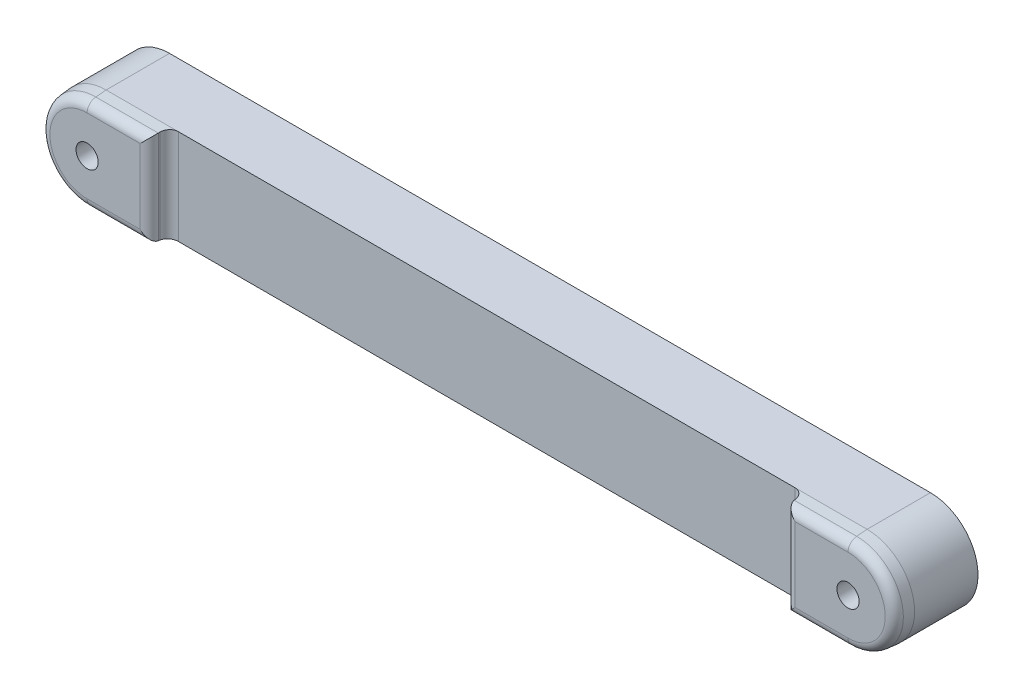
ISO-10303-21;
HEADER;
FILE_DESCRIPTION(('STEP AP214'),'2;1');
FILE_NAME('part.step','',(''),(''),'','','');
FILE_SCHEMA(('AUTOMOTIVE_DESIGN { 1 0 10303 214 1 1 1 1 }'));
ENDSEC;
DATA;
#1=APPLICATION_CONTEXT('core data for automotive mechanical design processes');
#2=APPLICATION_PROTOCOL_DEFINITION('international standard','automotive_design',2000,#1);
#3=PRODUCT_CONTEXT('',#1,'mechanical');
#4=PRODUCT('Part','Part','',(#3));
#5=PRODUCT_RELATED_PRODUCT_CATEGORY('part','',(#4));
#6=PRODUCT_DEFINITION_FORMATION('','',#4);
#7=PRODUCT_DEFINITION_CONTEXT('part definition',#1,'design');
#8=PRODUCT_DEFINITION('design','',#6,#7);
#9=PRODUCT_DEFINITION_SHAPE('','',#8);
#10=(LENGTH_UNIT() NAMED_UNIT(*) SI_UNIT(.MILLI.,.METRE.));
#11=(NAMED_UNIT(*) PLANE_ANGLE_UNIT() SI_UNIT($,.RADIAN.));
#12=(NAMED_UNIT(*) SI_UNIT($,.STERADIAN.) SOLID_ANGLE_UNIT());
#13=UNCERTAINTY_MEASURE_WITH_UNIT(LENGTH_MEASURE(1.E-05),#10,'distance_accuracy_value','');
#14=(GEOMETRIC_REPRESENTATION_CONTEXT(3) GLOBAL_UNCERTAINTY_ASSIGNED_CONTEXT((#13)) GLOBAL_UNIT_ASSIGNED_CONTEXT((#10,
#11,#12)) REPRESENTATION_CONTEXT('',''));
#15=CARTESIAN_POINT('',(0.,0.,0.));
#16=DIRECTION('',(0.,0.,1.));
#17=DIRECTION('',(1.,0.,0.));
#18=AXIS2_PLACEMENT_3D('',#15,#16,#17);
#19=CARTESIAN_POINT('',(60.,0.,0.));
#20=DIRECTION('',(0.,0.,1.));
#21=DIRECTION('',(1.,0.,0.));
#22=AXIS2_PLACEMENT_3D('',#19,#20,#21);
#23=CYLINDRICAL_SURFACE('',#22,1.75);
#24=CARTESIAN_POINT('',(60.,0.,13.));
#25=DIRECTION('',(0.,0.,-1.));
#26=DIRECTION('',(-1.,0.,0.));
#27=AXIS2_PLACEMENT_3D('',#24,#25,#26);
#28=CIRCLE('',#27,1.75);
#29=CARTESIAN_POINT('',(58.25,0.,13.));
#30=VERTEX_POINT('',#29);
#31=EDGE_CURVE('E292',#30,#30,#28,.T.);
#32=ORIENTED_EDGE('',*,*,#31,.F.);
#33=EDGE_LOOP('',(#32));
#34=FACE_BOUND('',#33,.T.);
#35=CARTESIAN_POINT('',(60.,0.,10.));
#36=DIRECTION('',(0.,0.,-1.));
#37=DIRECTION('',(-1.,0.,0.));
#38=AXIS2_PLACEMENT_3D('',#35,#36,#37);
#39=CIRCLE('',#38,1.75);
#40=CARTESIAN_POINT('',(58.25,0.,10.));
#41=VERTEX_POINT('',#40);
#42=EDGE_CURVE('E300',#41,#41,#39,.T.);
#43=ORIENTED_EDGE('',*,*,#42,.T.);
#44=EDGE_LOOP('',(#43));
#45=FACE_BOUND('',#44,.T.);
#46=ADVANCED_FACE('F41',(#34,#45),#23,.F.);
#47=CARTESIAN_POINT('',(-60.,0.,10.));
#48=DIRECTION('',(0.,0.,1.));
#49=DIRECTION('',(1.,0.,0.));
#50=AXIS2_PLACEMENT_3D('',#47,#48,#49);
#51=PLANE('',#50);
#52=DIRECTION('',(1.,0.,0.));
#53=VECTOR('',#52,1.);
#54=CARTESIAN_POINT('',(-60.,-7.5,10.));
#55=LINE('',#54,#53);
#56=CARTESIAN_POINT('',(-48.6255032389738,-7.5,10.));
#57=VERTEX_POINT('',#56);
#58=CARTESIAN_POINT('',(48.6255032389739,-7.49999999999998,10.));
#59=VERTEX_POINT('',#58);
#60=EDGE_CURVE('E197',#57,#59,#55,.T.);
#61=ORIENTED_EDGE('',*,*,#60,.T.);
#62=DIRECTION('',(0.,1.,0.));
#63=VECTOR('',#62,1.);
#64=CARTESIAN_POINT('',(48.6255032389738,-1.00498778964503E-13,10.));
#65=LINE('',#64,#63);
#66=CARTESIAN_POINT('',(48.6255032389739,7.50000000000002,10.));
#67=VERTEX_POINT('',#66);
#68=EDGE_CURVE('E280',#59,#67,#65,.T.);
#69=ORIENTED_EDGE('',*,*,#68,.T.);
#70=DIRECTION('',(-1.,0.,0.));
#71=VECTOR('',#70,1.);
#72=CARTESIAN_POINT('',(-60.,7.5,10.));
#73=LINE('',#72,#71);
#74=CARTESIAN_POINT('',(-48.6255032389739,7.5,10.));
#75=VERTEX_POINT('',#74);
#76=EDGE_CURVE('E208',#67,#75,#73,.T.);
#77=ORIENTED_EDGE('',*,*,#76,.T.);
#78=DIRECTION('',(0.,-1.,0.));
#79=VECTOR('',#78,1.);
#80=CARTESIAN_POINT('',(-48.6255032389738,-7.5,10.));
#81=LINE('',#80,#79);
#82=EDGE_CURVE('E239',#75,#57,#81,.T.);
#83=ORIENTED_EDGE('',*,*,#82,.T.);
#84=EDGE_LOOP('',(#61,#69,#77,#83));
#85=FACE_BOUND('',#84,.T.);
#86=ADVANCED_FACE('F324',(#85),#51,.T.);
#87=CARTESIAN_POINT('',(-60.,0.,0.));
#88=DIRECTION('',(0.,0.,1.));
#89=DIRECTION('',(1.,0.,0.));
#90=AXIS2_PLACEMENT_3D('',#87,#88,#89);
#91=CYLINDRICAL_SURFACE('',#90,1.75);
#92=CARTESIAN_POINT('',(-60.,0.,13.));
#93=DIRECTION('',(0.,0.,1.));
#94=DIRECTION('',(1.,0.,0.));
#95=AXIS2_PLACEMENT_3D('',#92,#93,#94);
#96=CIRCLE('',#95,1.75);
#97=CARTESIAN_POINT('',(-58.25,0.,13.));
#98=VERTEX_POINT('',#97);
#99=EDGE_CURVE('E249',#98,#98,#96,.T.);
#100=ORIENTED_EDGE('',*,*,#99,.T.);
#101=EDGE_LOOP('',(#100));
#102=FACE_BOUND('',#101,.T.);
#103=CARTESIAN_POINT('',(-60.,0.,10.));
#104=DIRECTION('',(0.,0.,-1.));
#105=DIRECTION('',(-1.,0.,0.));
#106=AXIS2_PLACEMENT_3D('',#103,#104,#105);
#107=CIRCLE('',#106,1.75);
#108=CARTESIAN_POINT('',(-61.75,0.,10.));
#109=VERTEX_POINT('',#108);
#110=EDGE_CURVE('E256',#109,#109,#107,.F.);
#111=ORIENTED_EDGE('',*,*,#110,.F.);
#112=EDGE_LOOP('',(#111));
#113=FACE_BOUND('',#112,.T.);
#114=ADVANCED_FACE('F330',(#102,#113),#91,.F.);
#115=CARTESIAN_POINT('',(-60.,0.,10.));
#116=DIRECTION('',(0.,0.,-1.));
#117=DIRECTION('',(-1.,0.,0.));
#118=AXIS2_PLACEMENT_3D('',#115,#116,#117);
#119=CYLINDRICAL_SURFACE('',#118,7.5);
#120=CARTESIAN_POINT('',(-60.,0.,0.));
#121=DIRECTION('',(0.,0.,1.));
#122=DIRECTION('',(1.,0.,0.));
#123=AXIS2_PLACEMENT_3D('',#120,#121,#122);
#124=CIRCLE('',#123,7.5);
#125=CARTESIAN_POINT('',(-60.,7.5,0.));
#126=VERTEX_POINT('',#125);
#127=CARTESIAN_POINT('',(-60.,-7.5,0.));
#128=VERTEX_POINT('',#127);
#129=EDGE_CURVE('E210',#126,#128,#124,.T.);
#130=ORIENTED_EDGE('',*,*,#129,.T.);
#131=DIRECTION('',(0.,0.,-1.));
#132=VECTOR('',#131,1.);
#133=CARTESIAN_POINT('',(-60.,-7.5,10.));
#134=LINE('',#133,#132);
#135=CARTESIAN_POINT('',(-60.,-7.5,10.));
#136=VERTEX_POINT('',#135);
#137=EDGE_CURVE('E196',#136,#128,#134,.T.);
#138=ORIENTED_EDGE('',*,*,#137,.F.);
#139=CARTESIAN_POINT('',(-60.,0.,10.));
#140=DIRECTION('',(0.,0.,1.));
#141=DIRECTION('',(1.,0.,0.));
#142=AXIS2_PLACEMENT_3D('',#139,#140,#141);
#143=CIRCLE('',#142,7.5);
#144=CARTESIAN_POINT('',(-60.,7.5,10.));
#145=VERTEX_POINT('',#144);
#146=EDGE_CURVE('E158',#145,#136,#143,.T.);
#147=ORIENTED_EDGE('',*,*,#146,.F.);
#148=DIRECTION('',(0.,0.,-1.));
#149=VECTOR('',#148,1.);
#150=CARTESIAN_POINT('',(-60.,7.5,10.));
#151=LINE('',#150,#149);
#152=EDGE_CURVE('E182',#145,#126,#151,.T.);
#153=ORIENTED_EDGE('',*,*,#152,.T.);
#154=EDGE_LOOP('',(#130,#138,#147,#153));
#155=FACE_BOUND('',#154,.T.);
#156=ADVANCED_FACE('F194',(#155),#119,.T.);
#157=CARTESIAN_POINT('',(-60.,-7.5,10.));
#158=DIRECTION('',(0.,1.,0.));
#159=DIRECTION('',(-1.,0.,0.));
#160=AXIS2_PLACEMENT_3D('',#157,#158,#159);
#161=PLANE('',#160);
#162=DIRECTION('',(1.,0.,0.));
#163=VECTOR('',#162,1.);
#164=CARTESIAN_POINT('',(-60.,-7.5,0.));
#165=LINE('',#164,#163);
#166=CARTESIAN_POINT('',(60.,-7.49999999999998,0.));
#167=VERTEX_POINT('',#166);
#168=EDGE_CURVE('E212',#128,#167,#165,.T.);
#169=ORIENTED_EDGE('',*,*,#168,.T.);
#170=DIRECTION('',(0.,0.,-1.));
#171=VECTOR('',#170,1.);
#172=CARTESIAN_POINT('',(60.,-7.49999999999998,10.));
#173=LINE('',#172,#171);
#174=CARTESIAN_POINT('',(60.,-7.49999999999998,10.));
#175=VERTEX_POINT('',#174);
#176=EDGE_CURVE('E216',#175,#167,#173,.T.);
#177=ORIENTED_EDGE('',*,*,#176,.F.);
#178=DIRECTION('',(-1.,0.,0.));
#179=VECTOR('',#178,1.);
#180=CARTESIAN_POINT('',(0.,-7.49999999999999,10.));
#181=LINE('',#180,#179);
#182=EDGE_CURVE('E57',#175,#59,#181,.T.);
#183=ORIENTED_EDGE('',*,*,#182,.T.);
#184=ORIENTED_EDGE('',*,*,#60,.F.);
#185=EDGE_CURVE('E199',#136,#57,#55,.T.);
#186=ORIENTED_EDGE('',*,*,#185,.F.);
#187=ORIENTED_EDGE('',*,*,#137,.T.);
#188=EDGE_LOOP('',(#169,#177,#183,#184,#186,#187));
#189=FACE_BOUND('',#188,.T.);
#190=ADVANCED_FACE('F396',(#189),#161,.F.);
#191=CARTESIAN_POINT('',(60.,0.,10.));
#192=DIRECTION('',(0.,0.,-1.));
#193=DIRECTION('',(-1.,0.,0.));
#194=AXIS2_PLACEMENT_3D('',#191,#192,#193);
#195=CYLINDRICAL_SURFACE('',#194,7.5);
#196=CARTESIAN_POINT('',(60.,0.,0.));
#197=DIRECTION('',(0.,0.,1.));
#198=DIRECTION('',(1.,0.,0.));
#199=AXIS2_PLACEMENT_3D('',#196,#197,#198);
#200=CIRCLE('',#199,7.5);
#201=CARTESIAN_POINT('',(60.,7.50000000000002,0.));
#202=VERTEX_POINT('',#201);
#203=EDGE_CURVE('E201',#167,#202,#200,.T.);
#204=ORIENTED_EDGE('',*,*,#203,.T.);
#205=DIRECTION('',(0.,0.,-1.));
#206=VECTOR('',#205,1.);
#207=CARTESIAN_POINT('',(60.,7.50000000000002,10.));
#208=LINE('',#207,#206);
#209=CARTESIAN_POINT('',(60.,7.50000000000002,10.));
#210=VERTEX_POINT('',#209);
#211=EDGE_CURVE('E190',#210,#202,#208,.T.);
#212=ORIENTED_EDGE('',*,*,#211,.F.);
#213=CARTESIAN_POINT('',(60.,0.,10.));
#214=DIRECTION('',(0.,0.,1.));
#215=DIRECTION('',(1.,0.,0.));
#216=AXIS2_PLACEMENT_3D('',#213,#214,#215);
#217=CIRCLE('',#216,7.5);
#218=EDGE_CURVE('E205',#175,#210,#217,.T.);
#219=ORIENTED_EDGE('',*,*,#218,.F.);
#220=ORIENTED_EDGE('',*,*,#176,.T.);
#221=EDGE_LOOP('',(#204,#212,#219,#220));
#222=FACE_BOUND('',#221,.T.);
#223=ADVANCED_FACE('F393',(#222),#195,.T.);
#224=CARTESIAN_POINT('',(-60.,7.5,10.));
#225=DIRECTION('',(0.,-1.,0.));
#226=DIRECTION('',(1.,0.,0.));
#227=AXIS2_PLACEMENT_3D('',#224,#225,#226);
#228=PLANE('',#227);
#229=DIRECTION('',(-1.,0.,0.));
#230=VECTOR('',#229,1.);
#231=CARTESIAN_POINT('',(-60.,7.5,0.));
#232=LINE('',#231,#230);
#233=EDGE_CURVE('E186',#202,#126,#232,.T.);
#234=ORIENTED_EDGE('',*,*,#233,.T.);
#235=ORIENTED_EDGE('',*,*,#152,.F.);
#236=DIRECTION('',(-1.,0.,0.));
#237=VECTOR('',#236,1.);
#238=CARTESIAN_POINT('',(0.,7.50000000000001,10.));
#239=LINE('',#238,#237);
#240=EDGE_CURVE('E169',#75,#145,#239,.T.);
#241=ORIENTED_EDGE('',*,*,#240,.F.);
#242=ORIENTED_EDGE('',*,*,#76,.F.);
#243=EDGE_CURVE('E191',#210,#67,#73,.T.);
#244=ORIENTED_EDGE('',*,*,#243,.F.);
#245=ORIENTED_EDGE('',*,*,#211,.T.);
#246=EDGE_LOOP('',(#234,#235,#241,#242,#244,#245));
#247=FACE_BOUND('',#246,.T.);
#248=ADVANCED_FACE('F183',(#247),#228,.F.);
#249=CARTESIAN_POINT('',(-60.,0.,0.));
#250=DIRECTION('',(0.,0.,1.));
#251=DIRECTION('',(1.,0.,0.));
#252=AXIS2_PLACEMENT_3D('',#249,#250,#251);
#253=PLANE('',#252);
#254=CARTESIAN_POINT('',(60.,0.,0.));
#255=DIRECTION('',(0.,0.,1.));
#256=DIRECTION('',(1.,0.,0.));
#257=AXIS2_PLACEMENT_3D('',#254,#255,#256);
#258=CIRCLE('',#257,4.00000000000001);
#259=CARTESIAN_POINT('',(64.,0.,0.));
#260=VERTEX_POINT('',#259);
#261=EDGE_CURVE('E303',#260,#260,#258,.T.);
#262=ORIENTED_EDGE('',*,*,#261,.T.);
#263=EDGE_LOOP('',(#262));
#264=FACE_BOUND('',#263,.T.);
#265=CARTESIAN_POINT('',(-60.,0.,0.));
#266=DIRECTION('',(0.,0.,-1.));
#267=DIRECTION('',(-1.,0.,0.));
#268=AXIS2_PLACEMENT_3D('',#265,#266,#267);
#269=CIRCLE('',#268,4.00000000000001);
#270=CARTESIAN_POINT('',(-64.,0.,0.));
#271=VERTEX_POINT('',#270);
#272=EDGE_CURVE('E259',#271,#271,#269,.T.);
#273=ORIENTED_EDGE('',*,*,#272,.F.);
#274=EDGE_LOOP('',(#273));
#275=FACE_BOUND('',#274,.T.);
#276=ORIENTED_EDGE('',*,*,#129,.F.);
#277=ORIENTED_EDGE('',*,*,#233,.F.);
#278=ORIENTED_EDGE('',*,*,#203,.F.);
#279=ORIENTED_EDGE('',*,*,#168,.F.);
#280=EDGE_LOOP('',(#276,#277,#278,#279));
#281=FACE_BOUND('',#280,.T.);
#282=ADVANCED_FACE('F379',(#264,#275,#281),#253,.F.);
#283=CARTESIAN_POINT('',(-50.,0.,10.));
#284=DIRECTION('',(0.996194698091746,0.,0.0871557427476582));
#285=DIRECTION('',(0.0871557427476582,0.,-0.996194698091746));
#286=AXIS2_PLACEMENT_3D('',#283,#284,#285);
#287=PLANE('',#286);
#288=DIRECTION('',(-0.0868265938642475,-0.0868265938642477,0.992432509138967));
#289=VECTOR('',#288,1.);
#290=CARTESIAN_POINT('',(-50.0565414305155,7.4434585694845,10.6462715080651));
#291=LINE('',#290,#289);
#292=CARTESIAN_POINT('',(-50.1426707044663,7.35732929553371,11.6307336141215));
#293=VERTEX_POINT('',#292);
#294=CARTESIAN_POINT('',(-50.1197952861115,7.38020471388852,11.3692663858785));
#295=VERTEX_POINT('',#294);
#296=EDGE_CURVE('E164',#293,#295,#291,.F.);
#297=ORIENTED_EDGE('',*,*,#296,.F.);
#298=DIRECTION('',(0.,-1.,0.));
#299=VECTOR('',#298,1.);
#300=CARTESIAN_POINT('',(-50.1426707044663,0.,11.6307336141215));
#301=LINE('',#300,#299);
#302=CARTESIAN_POINT('',(-50.1426707044663,-7.35732929553371,11.6307336141215));
#303=VERTEX_POINT('',#302);
#304=EDGE_CURVE('E237',#293,#303,#301,.T.);
#305=ORIENTED_EDGE('',*,*,#304,.T.);
#306=DIRECTION('',(-0.0868265938642477,0.0868265938642476,0.992432509138967));
#307=VECTOR('',#306,1.);
#308=CARTESIAN_POINT('',(-49.6230571298966,-7.87694287010335,5.69152327956573));
#309=LINE('',#308,#307);
#310=CARTESIAN_POINT('',(-50.1197952861115,-7.38020471388851,11.3692663858785));
#311=VERTEX_POINT('',#310);
#312=EDGE_CURVE('E178',#303,#311,#309,.F.);
#313=ORIENTED_EDGE('',*,*,#312,.T.);
#314=DIRECTION('',(0.,-1.,0.));
#315=VECTOR('',#314,1.);
#316=CARTESIAN_POINT('',(-50.1197952861115,7.5,11.3692663858785));
#317=LINE('',#316,#315);
#318=EDGE_CURVE('E235',#311,#295,#317,.F.);
#319=ORIENTED_EDGE('',*,*,#318,.T.);
#320=EDGE_LOOP('',(#297,#305,#313,#319));
#321=FACE_BOUND('',#320,.T.);
#322=ADVANCED_FACE('F376',(#321),#287,.T.);
#323=CARTESIAN_POINT('',(0.,7.50000000000001,10.));
#324=DIRECTION('',(0.,0.996194698091746,0.0871557427476582));
#325=DIRECTION('',(0.,-0.0871557427476582,0.996194698091746));
#326=AXIS2_PLACEMENT_3D('',#323,#324,#325);
#327=PLANE('',#326);
#328=DIRECTION('',(0.,0.0871557427476582,-0.996194698091746));
#329=VECTOR('',#328,1.);
#330=CARTESIAN_POINT('',(-60.,7.5,10.));
#331=LINE('',#330,#329);
#332=CARTESIAN_POINT('',(-60.,7.35732929553371,11.6307336141215));
#333=VERTEX_POINT('',#332);
#334=EDGE_CURVE('E153',#333,#145,#331,.T.);
#335=ORIENTED_EDGE('',*,*,#334,.F.);
#336=DIRECTION('',(-1.,0.,0.));
#337=VECTOR('',#336,1.);
#338=CARTESIAN_POINT('',(-50.2624659905778,7.35732929553371,11.6307336141215));
#339=LINE('',#338,#337);
#340=EDGE_CURVE('E233',#333,#293,#339,.F.);
#341=ORIENTED_EDGE('',*,*,#340,.T.);
#342=ORIENTED_EDGE('',*,*,#296,.T.);
#343=CARTESIAN_POINT('',(-48.6255032389739,7.36876700471112,11.5));
#344=DIRECTION('',(0.,0.996194698091746,0.0871557427476582));
#345=DIRECTION('',(0.,0.0871557427476582,-0.996194698091746));
#346=AXIS2_PLACEMENT_3D('',#343,#344,#345);
#347=ELLIPSE('',#346,1.50572975631502,1.5);
#348=EDGE_CURVE('E174',#295,#75,#347,.F.);
#349=ORIENTED_EDGE('',*,*,#348,.T.);
#350=ORIENTED_EDGE('',*,*,#240,.T.);
#351=EDGE_LOOP('',(#335,#341,#342,#349,#350));
#352=FACE_BOUND('',#351,.T.);
#353=ADVANCED_FACE('F171',(#352),#327,.T.);
#354=CARTESIAN_POINT('',(-60.,0.,10.));
#355=DIRECTION('',(0.,0.,-1.));
#356=DIRECTION('',(1.,0.,0.));
#357=AXIS2_PLACEMENT_3D('',#354,#355,#356);
#358=CONICAL_SURFACE('',#357,7.5,0.0872664625997165);
#359=DIRECTION('',(0.,-0.0871557427476582,-0.996194698091746));
#360=VECTOR('',#359,1.);
#361=CARTESIAN_POINT('',(-60.,-7.5,10.));
#362=LINE('',#361,#360);
#363=CARTESIAN_POINT('',(-60.,-7.35732929553371,11.6307336141215));
#364=VERTEX_POINT('',#363);
#365=EDGE_CURVE('E165',#364,#136,#362,.T.);
#366=ORIENTED_EDGE('',*,*,#365,.F.);
#367=CARTESIAN_POINT('',(-60.,0.,11.6307336141215));
#368=DIRECTION('',(0.,0.,-1.));
#369=DIRECTION('',(-1.,0.,0.));
#370=AXIS2_PLACEMENT_3D('',#367,#368,#369);
#371=CIRCLE('',#370,7.35732929553371);
#372=EDGE_CURVE('E161',#364,#333,#371,.T.);
#373=ORIENTED_EDGE('',*,*,#372,.T.);
#374=ORIENTED_EDGE('',*,*,#334,.T.);
#375=ORIENTED_EDGE('',*,*,#146,.T.);
#376=EDGE_LOOP('',(#366,#373,#374,#375));
#377=FACE_BOUND('',#376,.T.);
#378=ADVANCED_FACE('F156',(#377),#358,.T.);
#379=CARTESIAN_POINT('',(0.,-7.49999999999999,10.));
#380=DIRECTION('',(0.,-0.996194698091746,0.0871557427476582));
#381=DIRECTION('',(0.,-0.0871557427476582,-0.996194698091746));
#382=AXIS2_PLACEMENT_3D('',#379,#380,#381);
#383=PLANE('',#382);
#384=ORIENTED_EDGE('',*,*,#312,.F.);
#385=DIRECTION('',(1.,0.,0.));
#386=VECTOR('',#385,1.);
#387=CARTESIAN_POINT('',(-60.,-7.35732929553371,11.6307336141215));
#388=LINE('',#387,#386);
#389=EDGE_CURVE('E229',#303,#364,#388,.F.);
#390=ORIENTED_EDGE('',*,*,#389,.T.);
#391=ORIENTED_EDGE('',*,*,#365,.T.);
#392=ORIENTED_EDGE('',*,*,#185,.T.);
#393=CARTESIAN_POINT('',(-48.6255032389738,-7.36876700471111,11.5));
#394=DIRECTION('',(0.,-0.996194698091746,0.0871557427476582));
#395=DIRECTION('',(0.,0.0871557427476582,0.996194698091746));
#396=AXIS2_PLACEMENT_3D('',#393,#394,#395);
#397=ELLIPSE('',#396,1.50572975631502,1.5);
#398=EDGE_CURVE('E242',#57,#311,#397,.F.);
#399=ORIENTED_EDGE('',*,*,#398,.T.);
#400=EDGE_LOOP('',(#384,#390,#391,#392,#399));
#401=FACE_BOUND('',#400,.T.);
#402=ADVANCED_FACE('F374',(#401),#383,.T.);
#403=CARTESIAN_POINT('',(0.,0.,13.));
#404=DIRECTION('',(0.,0.,1.));
#405=DIRECTION('',(1.,0.,0.));
#406=AXIS2_PLACEMENT_3D('',#403,#404,#405);
#407=PLANE('',#406);
#408=ORIENTED_EDGE('',*,*,#99,.F.);
#409=EDGE_LOOP('',(#408));
#410=FACE_BOUND('',#409,.T.);
#411=CARTESIAN_POINT('',(-60.,0.,13.));
#412=DIRECTION('',(0.,0.,1.));
#413=DIRECTION('',(1.,0.,0.));
#414=AXIS2_PLACEMENT_3D('',#411,#412,#413);
#415=CIRCLE('',#414,5.86303724839609);
#416=CARTESIAN_POINT('',(-60.,5.86303724839609,13.));
#417=VERTEX_POINT('',#416);
#418=CARTESIAN_POINT('',(-60.,-5.86303724839609,13.));
#419=VERTEX_POINT('',#418);
#420=EDGE_CURVE('E224',#417,#419,#415,.T.);
#421=ORIENTED_EDGE('',*,*,#420,.T.);
#422=DIRECTION('',(-1.,0.,0.));
#423=VECTOR('',#422,1.);
#424=CARTESIAN_POINT('',(-50.2624659905778,-5.86303724839609,13.));
#425=LINE('',#424,#423);
#426=CARTESIAN_POINT('',(-51.6369627516039,-5.86303724839609,13.));
#427=VERTEX_POINT('',#426);
#428=EDGE_CURVE('E226',#419,#427,#425,.F.);
#429=ORIENTED_EDGE('',*,*,#428,.T.);
#430=DIRECTION('',(0.,-1.,0.));
#431=VECTOR('',#430,1.);
#432=CARTESIAN_POINT('',(-51.6369627516039,0.,13.));
#433=LINE('',#432,#431);
#434=CARTESIAN_POINT('',(-51.6369627516039,5.8630372483961,13.));
#435=VERTEX_POINT('',#434);
#436=EDGE_CURVE('E220',#427,#435,#433,.F.);
#437=ORIENTED_EDGE('',*,*,#436,.T.);
#438=DIRECTION('',(1.,0.,0.));
#439=VECTOR('',#438,1.);
#440=CARTESIAN_POINT('',(-60.,5.86303724839609,13.));
#441=LINE('',#440,#439);
#442=EDGE_CURVE('E222',#435,#417,#441,.F.);
#443=ORIENTED_EDGE('',*,*,#442,.T.);
#444=EDGE_LOOP('',(#421,#429,#437,#443));
#445=FACE_BOUND('',#444,.T.);
#446=ADVANCED_FACE('F370',(#410,#445),#407,.T.);
#447=CARTESIAN_POINT('',(0.,5.8630372483961,11.5));
#448=DIRECTION('',(-1.,0.,0.));
#449=DIRECTION('',(0.,-1.,0.));
#450=AXIS2_PLACEMENT_3D('',#447,#448,#449);
#451=CYLINDRICAL_SURFACE('',#450,1.5);
#452=CARTESIAN_POINT('',(-51.6369627516039,5.86303724839609,11.5));
#453=DIRECTION('',(0.707106781186548,-0.707106781186547,0.));
#454=DIRECTION('',(-0.707106781186547,-0.707106781186548,0.));
#455=AXIS2_PLACEMENT_3D('',#452,#453,#454);
#456=ELLIPSE('',#455,2.12132034355964,1.5);
#457=EDGE_CURVE('E251',#293,#435,#456,.T.);
#458=ORIENTED_EDGE('',*,*,#457,.F.);
#459=ORIENTED_EDGE('',*,*,#340,.F.);
#460=CARTESIAN_POINT('',(-60.,5.86303724839609,11.5));
#461=DIRECTION('',(-1.,0.,0.));
#462=DIRECTION('',(0.,0.,1.));
#463=AXIS2_PLACEMENT_3D('',#460,#461,#462);
#464=CIRCLE('',#463,1.5);
#465=EDGE_CURVE('E179',#417,#333,#464,.T.);
#466=ORIENTED_EDGE('',*,*,#465,.F.);
#467=ORIENTED_EDGE('',*,*,#442,.F.);
#468=EDGE_LOOP('',(#458,#459,#466,#467));
#469=FACE_BOUND('',#468,.T.);
#470=ADVANCED_FACE('F373',(#469),#451,.T.);
#471=CARTESIAN_POINT('',(-60.,0.,11.5));
#472=DIRECTION('',(0.,0.,1.));
#473=DIRECTION('',(1.,0.,0.));
#474=AXIS2_PLACEMENT_3D('',#471,#472,#473);
#475=TOROIDAL_SURFACE('',#474,5.86303724839609,1.5);
#476=ORIENTED_EDGE('',*,*,#465,.T.);
#477=ORIENTED_EDGE('',*,*,#372,.F.);
#478=CARTESIAN_POINT('',(-60.,-5.86303724839609,11.5));
#479=DIRECTION('',(1.,0.,0.));
#480=DIRECTION('',(0.,0.,-1.));
#481=AXIS2_PLACEMENT_3D('',#478,#479,#480);
#482=CIRCLE('',#481,1.5);
#483=EDGE_CURVE('E248',#419,#364,#482,.T.);
#484=ORIENTED_EDGE('',*,*,#483,.F.);
#485=ORIENTED_EDGE('',*,*,#420,.F.);
#486=EDGE_LOOP('',(#476,#477,#484,#485));
#487=FACE_BOUND('',#486,.T.);
#488=ADVANCED_FACE('F409',(#487),#475,.T.);
#489=CARTESIAN_POINT('',(-51.6369627516039,0.,11.5));
#490=DIRECTION('',(0.,-1.,0.));
#491=DIRECTION('',(1.,0.,0.));
#492=AXIS2_PLACEMENT_3D('',#489,#490,#491);
#493=CYLINDRICAL_SURFACE('',#492,1.5);
#494=ORIENTED_EDGE('',*,*,#457,.T.);
#495=ORIENTED_EDGE('',*,*,#436,.F.);
#496=CARTESIAN_POINT('',(-51.6369627516039,-5.86303724839609,11.5));
#497=DIRECTION('',(-0.707106781186547,-0.707106781186548,0.));
#498=DIRECTION('',(0.707106781186548,-0.707106781186547,0.));
#499=AXIS2_PLACEMENT_3D('',#496,#497,#498);
#500=ELLIPSE('',#499,2.12132034355964,1.5);
#501=EDGE_CURVE('E246',#303,#427,#500,.T.);
#502=ORIENTED_EDGE('',*,*,#501,.F.);
#503=ORIENTED_EDGE('',*,*,#304,.F.);
#504=EDGE_LOOP('',(#494,#495,#502,#503));
#505=FACE_BOUND('',#504,.T.);
#506=ADVANCED_FACE('F405',(#505),#493,.T.);
#507=CARTESIAN_POINT('',(0.,-5.86303724839608,11.5));
#508=DIRECTION('',(1.,0.,0.));
#509=DIRECTION('',(0.,1.,0.));
#510=AXIS2_PLACEMENT_3D('',#507,#508,#509);
#511=CYLINDRICAL_SURFACE('',#510,1.5);
#512=ORIENTED_EDGE('',*,*,#483,.T.);
#513=ORIENTED_EDGE('',*,*,#389,.F.);
#514=ORIENTED_EDGE('',*,*,#501,.T.);
#515=ORIENTED_EDGE('',*,*,#428,.F.);
#516=EDGE_LOOP('',(#512,#513,#514,#515));
#517=FACE_BOUND('',#516,.T.);
#518=ADVANCED_FACE('F402',(#517),#511,.T.);
#519=CARTESIAN_POINT('',(-48.6255032389739,0.,11.5));
#520=DIRECTION('',(0.,1.,0.));
#521=DIRECTION('',(-1.,0.,0.));
#522=AXIS2_PLACEMENT_3D('',#519,#520,#521);
#523=CYLINDRICAL_SURFACE('',#522,1.5);
#524=ORIENTED_EDGE('',*,*,#348,.F.);
#525=ORIENTED_EDGE('',*,*,#318,.F.);
#526=ORIENTED_EDGE('',*,*,#398,.F.);
#527=ORIENTED_EDGE('',*,*,#82,.F.);
#528=EDGE_LOOP('',(#524,#525,#526,#527));
#529=FACE_BOUND('',#528,.T.);
#530=ADVANCED_FACE('F363',(#529),#523,.F.);
#531=CARTESIAN_POINT('',(-60.,0.,10.));
#532=DIRECTION('',(0.,0.,-1.));
#533=DIRECTION('',(-1.,0.,0.));
#534=AXIS2_PLACEMENT_3D('',#531,#532,#533);
#535=PLANE('',#534);
#536=CARTESIAN_POINT('',(-60.,0.,10.));
#537=DIRECTION('',(0.,0.,-1.));
#538=DIRECTION('',(-1.,0.,0.));
#539=AXIS2_PLACEMENT_3D('',#536,#537,#538);
#540=CIRCLE('',#539,1.99999999999999);
#541=CARTESIAN_POINT('',(-62.,0.,10.));
#542=VERTEX_POINT('',#541);
#543=EDGE_CURVE('E51',#542,#542,#540,.T.);
#544=ORIENTED_EDGE('',*,*,#543,.T.);
#545=EDGE_LOOP('',(#544));
#546=FACE_BOUND('',#545,.T.);
#547=ORIENTED_EDGE('',*,*,#110,.T.);
#548=EDGE_LOOP('',(#547));
#549=FACE_BOUND('',#548,.T.);
#550=ADVANCED_FACE('F311',(#546,#549),#535,.T.);
#551=CARTESIAN_POINT('',(-60.,0.,10.));
#552=DIRECTION('',(0.,0.,-1.));
#553=DIRECTION('',(-1.,0.,0.));
#554=AXIS2_PLACEMENT_3D('',#551,#552,#553);
#555=CYLINDRICAL_SURFACE('',#554,4.00000000000001);
#556=CARTESIAN_POINT('',(-60.,0.,8.00000000000001));
#557=DIRECTION('',(0.,0.,-1.));
#558=DIRECTION('',(-1.,0.,0.));
#559=AXIS2_PLACEMENT_3D('',#556,#557,#558);
#560=CIRCLE('',#559,4.00000000000001);
#561=CARTESIAN_POINT('',(-64.,0.,8.00000000000001));
#562=VERTEX_POINT('',#561);
#563=EDGE_CURVE('E11',#562,#562,#560,.F.);
#564=ORIENTED_EDGE('',*,*,#563,.T.);
#565=EDGE_LOOP('',(#564));
#566=FACE_BOUND('',#565,.T.);
#567=ORIENTED_EDGE('',*,*,#272,.T.);
#568=EDGE_LOOP('',(#567));
#569=FACE_BOUND('',#568,.T.);
#570=ADVANCED_FACE('F349',(#566,#569),#555,.F.);
#571=CARTESIAN_POINT('',(50.,0.,10.));
#572=DIRECTION('',(-0.996194698091746,0.,0.0871557427476582));
#573=DIRECTION('',(0.0871557427476582,0.,0.996194698091746));
#574=AXIS2_PLACEMENT_3D('',#571,#572,#573);
#575=PLANE('',#574);
#576=DIRECTION('',(0.0868265938642477,0.0868265938642476,0.992432509138967));
#577=VECTOR('',#576,1.);
#578=CARTESIAN_POINT('',(50.0565414305155,-7.44345856948449,10.6462715080651));
#579=LINE('',#578,#577);
#580=CARTESIAN_POINT('',(50.1426707044663,-7.35732929553371,11.6307336141215));
#581=VERTEX_POINT('',#580);
#582=CARTESIAN_POINT('',(50.1197952861115,-7.38020471388851,11.3692663858785));
#583=VERTEX_POINT('',#582);
#584=EDGE_CURVE('E464',#581,#583,#579,.F.);
#585=ORIENTED_EDGE('',*,*,#584,.F.);
#586=DIRECTION('',(0.,-1.,0.));
#587=VECTOR('',#586,1.);
#588=CARTESIAN_POINT('',(50.1426707044663,7.23753400942223,11.6307336141215));
#589=LINE('',#588,#587);
#590=CARTESIAN_POINT('',(50.1426707044663,7.35732929553371,11.6307336141215));
#591=VERTEX_POINT('',#590);
#592=EDGE_CURVE('E278',#581,#591,#589,.F.);
#593=ORIENTED_EDGE('',*,*,#592,.T.);
#594=DIRECTION('',(0.0868265938642475,-0.0868265938642477,0.992432509138967));
#595=VECTOR('',#594,1.);
#596=CARTESIAN_POINT('',(49.6230571298967,7.87694287010335,5.69152327956574));
#597=LINE('',#596,#595);
#598=CARTESIAN_POINT('',(50.1197952861115,7.38020471388852,11.3692663858785));
#599=VERTEX_POINT('',#598);
#600=EDGE_CURVE('E452',#591,#599,#597,.F.);
#601=ORIENTED_EDGE('',*,*,#600,.T.);
#602=DIRECTION('',(0.,-1.,0.));
#603=VECTOR('',#602,1.);
#604=CARTESIAN_POINT('',(50.1197952861115,0.,11.3692663858785));
#605=LINE('',#604,#603);
#606=EDGE_CURVE('E275',#599,#583,#605,.T.);
#607=ORIENTED_EDGE('',*,*,#606,.T.);
#608=EDGE_LOOP('',(#585,#593,#601,#607));
#609=FACE_BOUND('',#608,.T.);
#610=ADVANCED_FACE('F345',(#609),#575,.T.);
#611=CARTESIAN_POINT('',(0.,-7.49999999999999,10.));
#612=DIRECTION('',(0.,-0.996194698091746,0.0871557427476582));
#613=DIRECTION('',(0.,-0.0871557427476582,-0.996194698091746));
#614=AXIS2_PLACEMENT_3D('',#611,#612,#613);
#615=PLANE('',#614);
#616=DIRECTION('',(0.,-0.0871557427476582,-0.996194698091746));
#617=VECTOR('',#616,1.);
#618=CARTESIAN_POINT('',(60.,-7.5,10.));
#619=LINE('',#618,#617);
#620=CARTESIAN_POINT('',(60.,-7.35732929553371,11.6307336141215));
#621=VERTEX_POINT('',#620);
#622=EDGE_CURVE('E460',#621,#175,#619,.T.);
#623=ORIENTED_EDGE('',*,*,#622,.F.);
#624=DIRECTION('',(-1.,0.,0.));
#625=VECTOR('',#624,1.);
#626=CARTESIAN_POINT('',(0.,-7.3573292955337,11.6307336141215));
#627=LINE('',#626,#625);
#628=EDGE_CURVE('E273',#621,#581,#627,.T.);
#629=ORIENTED_EDGE('',*,*,#628,.T.);
#630=ORIENTED_EDGE('',*,*,#584,.T.);
#631=CARTESIAN_POINT('',(48.6255032389738,-7.36876700471111,11.5));
#632=DIRECTION('',(0.,-0.996194698091746,0.0871557427476582));
#633=DIRECTION('',(0.,0.0871557427476582,0.996194698091746));
#634=AXIS2_PLACEMENT_3D('',#631,#632,#633);
#635=ELLIPSE('',#634,1.50572975631502,1.5);
#636=EDGE_CURVE('E283',#583,#59,#635,.F.);
#637=ORIENTED_EDGE('',*,*,#636,.T.);
#638=ORIENTED_EDGE('',*,*,#182,.F.);
#639=EDGE_LOOP('',(#623,#629,#630,#637,#638));
#640=FACE_BOUND('',#639,.T.);
#641=ADVANCED_FACE('F348',(#640),#615,.T.);
#642=CARTESIAN_POINT('',(60.,0.,10.));
#643=DIRECTION('',(0.,0.,-1.));
#644=DIRECTION('',(-1.,0.,0.));
#645=AXIS2_PLACEMENT_3D('',#642,#643,#644);
#646=CONICAL_SURFACE('',#645,7.5,0.0872664625997165);
#647=DIRECTION('',(0.,0.0871557427476582,-0.996194698091746));
#648=VECTOR('',#647,1.);
#649=CARTESIAN_POINT('',(60.,7.5,10.));
#650=LINE('',#649,#648);
#651=CARTESIAN_POINT('',(60.,7.35732929553371,11.6307336141215));
#652=VERTEX_POINT('',#651);
#653=EDGE_CURVE('E458',#652,#210,#650,.T.);
#654=ORIENTED_EDGE('',*,*,#653,.F.);
#655=CARTESIAN_POINT('',(60.,0.,11.6307336141215));
#656=DIRECTION('',(0.,0.,1.));
#657=DIRECTION('',(1.,0.,0.));
#658=AXIS2_PLACEMENT_3D('',#655,#656,#657);
#659=CIRCLE('',#658,7.35732929553371);
#660=EDGE_CURVE('E271',#652,#621,#659,.F.);
#661=ORIENTED_EDGE('',*,*,#660,.T.);
#662=ORIENTED_EDGE('',*,*,#622,.T.);
#663=ORIENTED_EDGE('',*,*,#218,.T.);
#664=EDGE_LOOP('',(#654,#661,#662,#663));
#665=FACE_BOUND('',#664,.T.);
#666=ADVANCED_FACE('F353',(#665),#646,.T.);
#667=CARTESIAN_POINT('',(0.,7.50000000000001,10.));
#668=DIRECTION('',(0.,0.996194698091746,0.0871557427476582));
#669=DIRECTION('',(0.,-0.0871557427476582,0.996194698091746));
#670=AXIS2_PLACEMENT_3D('',#667,#668,#669);
#671=PLANE('',#670);
#672=ORIENTED_EDGE('',*,*,#600,.F.);
#673=DIRECTION('',(1.,0.,0.));
#674=VECTOR('',#673,1.);
#675=CARTESIAN_POINT('',(0.,7.35732929553372,11.6307336141215));
#676=LINE('',#675,#674);
#677=EDGE_CURVE('E245',#591,#652,#676,.T.);
#678=ORIENTED_EDGE('',*,*,#677,.T.);
#679=ORIENTED_EDGE('',*,*,#653,.T.);
#680=ORIENTED_EDGE('',*,*,#243,.T.);
#681=CARTESIAN_POINT('',(48.6255032389739,7.36876700471112,11.5));
#682=DIRECTION('',(0.,0.996194698091746,0.0871557427476582));
#683=DIRECTION('',(0.,0.0871557427476582,-0.996194698091746));
#684=AXIS2_PLACEMENT_3D('',#681,#682,#683);
#685=ELLIPSE('',#684,1.50572975631502,1.5);
#686=EDGE_CURVE('E286',#67,#599,#685,.F.);
#687=ORIENTED_EDGE('',*,*,#686,.T.);
#688=EDGE_LOOP('',(#672,#678,#679,#680,#687));
#689=FACE_BOUND('',#688,.T.);
#690=ADVANCED_FACE('F343',(#689),#671,.T.);
#691=CARTESIAN_POINT('',(0.,0.,13.));
#692=DIRECTION('',(0.,0.,1.));
#693=DIRECTION('',(-1.,0.,0.));
#694=AXIS2_PLACEMENT_3D('',#691,#692,#693);
#695=PLANE('',#694);
#696=ORIENTED_EDGE('',*,*,#31,.T.);
#697=EDGE_LOOP('',(#696));
#698=FACE_BOUND('',#697,.T.);
#699=CARTESIAN_POINT('',(60.,0.,13.));
#700=DIRECTION('',(0.,0.,1.));
#701=DIRECTION('',(1.,0.,0.));
#702=AXIS2_PLACEMENT_3D('',#699,#700,#701);
#703=CIRCLE('',#702,5.86303724839609);
#704=CARTESIAN_POINT('',(60.,-5.86303724839609,13.));
#705=VERTEX_POINT('',#704);
#706=CARTESIAN_POINT('',(60.,5.86303724839609,13.));
#707=VERTEX_POINT('',#706);
#708=EDGE_CURVE('E266',#705,#707,#703,.T.);
#709=ORIENTED_EDGE('',*,*,#708,.T.);
#710=DIRECTION('',(1.,0.,0.));
#711=VECTOR('',#710,1.);
#712=CARTESIAN_POINT('',(0.,5.8630372483961,13.));
#713=LINE('',#712,#711);
#714=CARTESIAN_POINT('',(51.6369627516039,5.86303724839609,13.));
#715=VERTEX_POINT('',#714);
#716=EDGE_CURVE('E268',#707,#715,#713,.F.);
#717=ORIENTED_EDGE('',*,*,#716,.T.);
#718=DIRECTION('',(0.,1.,0.));
#719=VECTOR('',#718,1.);
#720=CARTESIAN_POINT('',(51.6369627516039,-7.23753400942223,13.));
#721=LINE('',#720,#719);
#722=CARTESIAN_POINT('',(51.6369627516039,-5.86303724839609,13.));
#723=VERTEX_POINT('',#722);
#724=EDGE_CURVE('E262',#715,#723,#721,.F.);
#725=ORIENTED_EDGE('',*,*,#724,.T.);
#726=DIRECTION('',(-1.,0.,0.));
#727=VECTOR('',#726,1.);
#728=CARTESIAN_POINT('',(0.,-5.86303724839608,13.));
#729=LINE('',#728,#727);
#730=EDGE_CURVE('E264',#723,#705,#729,.F.);
#731=ORIENTED_EDGE('',*,*,#730,.T.);
#732=EDGE_LOOP('',(#709,#717,#725,#731));
#733=FACE_BOUND('',#732,.T.);
#734=ADVANCED_FACE('F339',(#698,#733),#695,.T.);
#735=CARTESIAN_POINT('',(0.,-5.86303724839608,11.5));
#736=DIRECTION('',(-1.,0.,0.));
#737=DIRECTION('',(0.,-1.,0.));
#738=AXIS2_PLACEMENT_3D('',#735,#736,#737);
#739=CYLINDRICAL_SURFACE('',#738,1.5);
#740=CARTESIAN_POINT('',(60.,-5.86303724839609,11.5));
#741=DIRECTION('',(1.,0.,0.));
#742=DIRECTION('',(0.,0.,-1.));
#743=AXIS2_PLACEMENT_3D('',#740,#741,#742);
#744=CIRCLE('',#743,1.5);
#745=EDGE_CURVE('E294',#705,#621,#744,.T.);
#746=ORIENTED_EDGE('',*,*,#745,.F.);
#747=ORIENTED_EDGE('',*,*,#730,.F.);
#748=CARTESIAN_POINT('',(51.6369627516039,-5.86303724839609,11.5));
#749=DIRECTION('',(0.707106781186547,-0.707106781186548,0.));
#750=DIRECTION('',(-0.707106781186548,-0.707106781186547,0.));
#751=AXIS2_PLACEMENT_3D('',#748,#749,#750);
#752=ELLIPSE('',#751,2.12132034355964,1.5);
#753=EDGE_CURVE('E297',#581,#723,#752,.F.);
#754=ORIENTED_EDGE('',*,*,#753,.F.);
#755=ORIENTED_EDGE('',*,*,#628,.F.);
#756=EDGE_LOOP('',(#746,#747,#754,#755));
#757=FACE_BOUND('',#756,.T.);
#758=ADVANCED_FACE('F342',(#757),#739,.T.);
#759=CARTESIAN_POINT('',(51.6369627516039,0.,11.5));
#760=DIRECTION('',(0.,-1.,0.));
#761=DIRECTION('',(1.,0.,0.));
#762=AXIS2_PLACEMENT_3D('',#759,#760,#761);
#763=CYLINDRICAL_SURFACE('',#762,1.5);
#764=ORIENTED_EDGE('',*,*,#753,.T.);
#765=ORIENTED_EDGE('',*,*,#724,.F.);
#766=CARTESIAN_POINT('',(51.6369627516039,5.86303724839609,11.5));
#767=DIRECTION('',(-0.707106781186548,-0.707106781186547,0.));
#768=DIRECTION('',(0.707106781186547,-0.707106781186548,0.));
#769=AXIS2_PLACEMENT_3D('',#766,#767,#768);
#770=ELLIPSE('',#769,2.12132034355964,1.5);
#771=EDGE_CURVE('E291',#591,#715,#770,.F.);
#772=ORIENTED_EDGE('',*,*,#771,.F.);
#773=ORIENTED_EDGE('',*,*,#592,.F.);
#774=EDGE_LOOP('',(#764,#765,#772,#773));
#775=FACE_BOUND('',#774,.T.);
#776=ADVANCED_FACE('F428',(#775),#763,.T.);
#777=CARTESIAN_POINT('',(60.,0.,11.5));
#778=DIRECTION('',(0.,0.,1.));
#779=DIRECTION('',(1.,0.,0.));
#780=AXIS2_PLACEMENT_3D('',#777,#778,#779);
#781=TOROIDAL_SURFACE('',#780,5.86303724839609,1.5);
#782=ORIENTED_EDGE('',*,*,#745,.T.);
#783=ORIENTED_EDGE('',*,*,#660,.F.);
#784=CARTESIAN_POINT('',(60.,5.86303724839609,11.5));
#785=DIRECTION('',(-1.,0.,0.));
#786=DIRECTION('',(0.,0.,1.));
#787=AXIS2_PLACEMENT_3D('',#784,#785,#786);
#788=CIRCLE('',#787,1.5);
#789=EDGE_CURVE('E289',#707,#652,#788,.T.);
#790=ORIENTED_EDGE('',*,*,#789,.F.);
#791=ORIENTED_EDGE('',*,*,#708,.F.);
#792=EDGE_LOOP('',(#782,#783,#790,#791));
#793=FACE_BOUND('',#792,.T.);
#794=ADVANCED_FACE('F424',(#793),#781,.T.);
#795=CARTESIAN_POINT('',(0.,5.8630372483961,11.5));
#796=DIRECTION('',(1.,0.,0.));
#797=DIRECTION('',(0.,1.,0.));
#798=AXIS2_PLACEMENT_3D('',#795,#796,#797);
#799=CYLINDRICAL_SURFACE('',#798,1.5);
#800=ORIENTED_EDGE('',*,*,#771,.T.);
#801=ORIENTED_EDGE('',*,*,#716,.F.);
#802=ORIENTED_EDGE('',*,*,#789,.T.);
#803=ORIENTED_EDGE('',*,*,#677,.F.);
#804=EDGE_LOOP('',(#800,#801,#802,#803));
#805=FACE_BOUND('',#804,.T.);
#806=ADVANCED_FACE('F420',(#805),#799,.T.);
#807=CARTESIAN_POINT('',(48.6255032389739,0.,11.5));
#808=DIRECTION('',(0.,1.,0.));
#809=DIRECTION('',(-1.,0.,0.));
#810=AXIS2_PLACEMENT_3D('',#807,#808,#809);
#811=CYLINDRICAL_SURFACE('',#810,1.5);
#812=ORIENTED_EDGE('',*,*,#686,.F.);
#813=ORIENTED_EDGE('',*,*,#68,.F.);
#814=ORIENTED_EDGE('',*,*,#636,.F.);
#815=ORIENTED_EDGE('',*,*,#606,.F.);
#816=EDGE_LOOP('',(#812,#813,#814,#815));
#817=FACE_BOUND('',#816,.T.);
#818=ADVANCED_FACE('F423',(#817),#811,.F.);
#819=CARTESIAN_POINT('',(60.,0.,10.));
#820=DIRECTION('',(0.,0.,-1.));
#821=DIRECTION('',(-1.,0.,0.));
#822=AXIS2_PLACEMENT_3D('',#819,#820,#821);
#823=CYLINDRICAL_SURFACE('',#822,4.00000000000001);
#824=CARTESIAN_POINT('',(60.,0.,7.99999999999997));
#825=DIRECTION('',(0.,0.,-1.));
#826=DIRECTION('',(-1.,0.,0.));
#827=AXIS2_PLACEMENT_3D('',#824,#825,#826);
#828=CIRCLE('',#827,4.00000000000001);
#829=CARTESIAN_POINT('',(56.,0.,7.99999999999997));
#830=VERTEX_POINT('',#829);
#831=EDGE_CURVE('E288',#830,#830,#828,.F.);
#832=ORIENTED_EDGE('',*,*,#831,.T.);
#833=EDGE_LOOP('',(#832));
#834=FACE_BOUND('',#833,.T.);
#835=ORIENTED_EDGE('',*,*,#261,.F.);
#836=EDGE_LOOP('',(#835));
#837=FACE_BOUND('',#836,.T.);
#838=ADVANCED_FACE('F337',(#834,#837),#823,.F.);
#839=CARTESIAN_POINT('',(60.,0.,10.));
#840=DIRECTION('',(0.,0.,-1.));
#841=DIRECTION('',(1.,0.,0.));
#842=AXIS2_PLACEMENT_3D('',#839,#840,#841);
#843=PLANE('',#842);
#844=CARTESIAN_POINT('',(60.,0.,10.));
#845=DIRECTION('',(0.,0.,-1.));
#846=DIRECTION('',(-1.,0.,0.));
#847=AXIS2_PLACEMENT_3D('',#844,#845,#846);
#848=CIRCLE('',#847,2.);
#849=CARTESIAN_POINT('',(58.,0.,10.));
#850=VERTEX_POINT('',#849);
#851=EDGE_CURVE('E306',#850,#850,#848,.T.);
#852=ORIENTED_EDGE('',*,*,#851,.T.);
#853=EDGE_LOOP('',(#852));
#854=FACE_BOUND('',#853,.T.);
#855=ORIENTED_EDGE('',*,*,#42,.F.);
#856=EDGE_LOOP('',(#855));
#857=FACE_BOUND('',#856,.T.);
#858=ADVANCED_FACE('F320',(#854,#857),#843,.T.);
#859=CARTESIAN_POINT('',(60.,0.,7.99999999999997));
#860=DIRECTION('',(0.,0.,-1.));
#861=DIRECTION('',(-1.,0.,0.));
#862=AXIS2_PLACEMENT_3D('',#859,#860,#861);
#863=CONICAL_SURFACE('',#862,4.00000000000001,0.785398163397442);
#864=ORIENTED_EDGE('',*,*,#851,.F.);
#865=EDGE_LOOP('',(#864));
#866=FACE_BOUND('',#865,.T.);
#867=ORIENTED_EDGE('',*,*,#831,.F.);
#868=EDGE_LOOP('',(#867));
#869=FACE_BOUND('',#868,.T.);
#870=ADVANCED_FACE('F315',(#866,#869),#863,.F.);
#871=CARTESIAN_POINT('',(-60.,0.,10.));
#872=DIRECTION('',(0.,0.,-1.));
#873=DIRECTION('',(-1.,0.,0.));
#874=AXIS2_PLACEMENT_3D('',#871,#872,#873);
#875=CONICAL_SURFACE('',#874,1.99999999999999,0.785398163397455);
#876=ORIENTED_EDGE('',*,*,#563,.F.);
#877=EDGE_LOOP('',(#876));
#878=FACE_BOUND('',#877,.T.);
#879=ORIENTED_EDGE('',*,*,#543,.F.);
#880=EDGE_LOOP('',(#879));
#881=FACE_BOUND('',#880,.T.);
#882=ADVANCED_FACE('F44',(#878,#881),#875,.F.);
#883=CLOSED_SHELL('',(#46,#86,#114,#156,#190,#223,#248,#282,#322,#353,#378,#402,#446,#470,#488,
#506,#518,#530,#550,#570,#610,#641,#666,#690,#734,#758,#776,#794,#806,#818,#838,#858,#870,#882));
#884=MANIFOLD_SOLID_BREP('B2',#883);
#885=ADVANCED_BREP_SHAPE_REPRESENTATION('',(#18,#884),#14);
#886=SHAPE_DEFINITION_REPRESENTATION(#9,#885);
ENDSEC;
END-ISO-10303-21;
